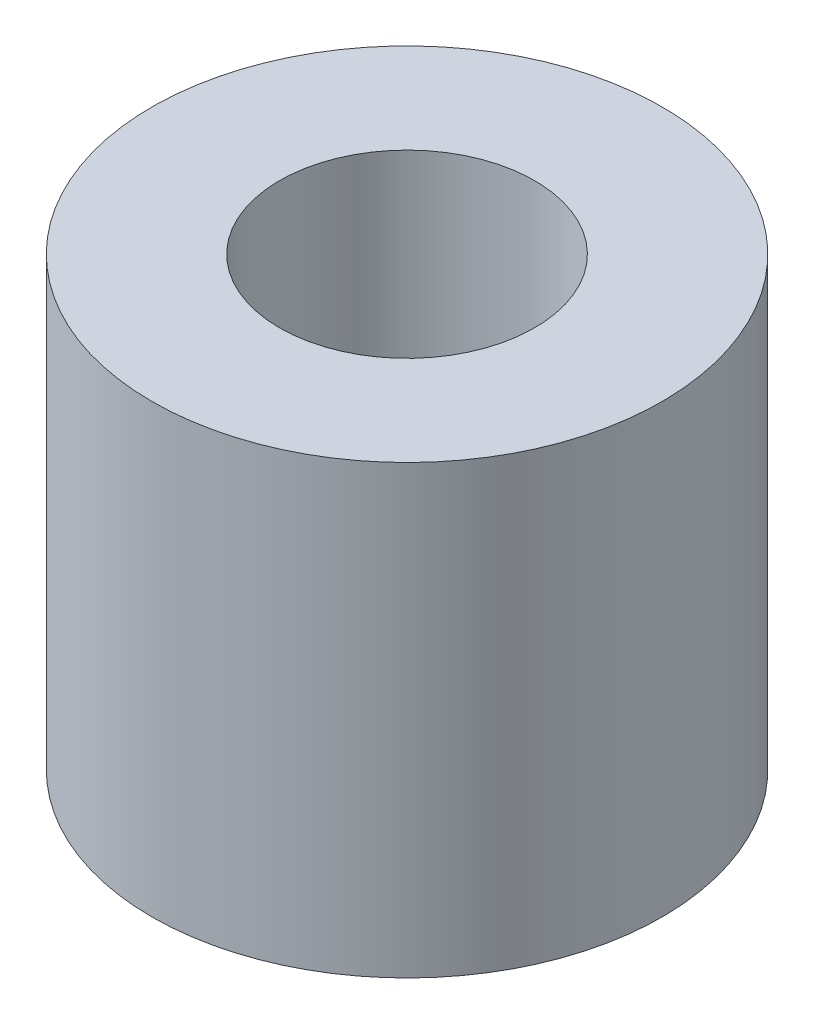
ISO-10303-21;
HEADER;
FILE_DESCRIPTION(('STEP AP214'),'2;1');
FILE_NAME('part.step','',(''),(''),'','','');
FILE_SCHEMA(('AUTOMOTIVE_DESIGN { 1 0 10303 214 1 1 1 1 }'));
ENDSEC;
DATA;
#1=APPLICATION_CONTEXT('core data for automotive mechanical design processes');
#2=APPLICATION_PROTOCOL_DEFINITION('international standard','automotive_design',2000,#1);
#3=PRODUCT_CONTEXT('',#1,'mechanical');
#4=PRODUCT('Part','Part','',(#3));
#5=PRODUCT_RELATED_PRODUCT_CATEGORY('part','',(#4));
#6=PRODUCT_DEFINITION_FORMATION('','',#4);
#7=PRODUCT_DEFINITION_CONTEXT('part definition',#1,'design');
#8=PRODUCT_DEFINITION('design','',#6,#7);
#9=PRODUCT_DEFINITION_SHAPE('','',#8);
#10=(LENGTH_UNIT() NAMED_UNIT(*) SI_UNIT(.MILLI.,.METRE.));
#11=(NAMED_UNIT(*) PLANE_ANGLE_UNIT() SI_UNIT($,.RADIAN.));
#12=(NAMED_UNIT(*) SI_UNIT($,.STERADIAN.) SOLID_ANGLE_UNIT());
#13=UNCERTAINTY_MEASURE_WITH_UNIT(LENGTH_MEASURE(1.E-05),#10,'distance_accuracy_value','');
#14=(GEOMETRIC_REPRESENTATION_CONTEXT(3) GLOBAL_UNCERTAINTY_ASSIGNED_CONTEXT((#13)) GLOBAL_UNIT_ASSIGNED_CONTEXT((#10,
#11,#12)) REPRESENTATION_CONTEXT('',''));
#15=CARTESIAN_POINT('',(0.,0.,0.));
#16=DIRECTION('',(0.,0.,1.));
#17=DIRECTION('',(1.,0.,0.));
#18=AXIS2_PLACEMENT_3D('',#15,#16,#17);
#19=CARTESIAN_POINT('',(0.,7.,0.));
#20=DIRECTION('',(0.,1.,0.));
#21=DIRECTION('',(0.,0.,1.));
#22=AXIS2_PLACEMENT_3D('',#19,#20,#21);
#23=PLANE('',#22);
#24=CARTESIAN_POINT('',(0.,7.,0.));
#25=DIRECTION('',(0.,1.,0.));
#26=DIRECTION('',(0.,0.,1.));
#27=AXIS2_PLACEMENT_3D('',#24,#25,#26);
#28=CIRCLE('',#27,4.);
#29=CARTESIAN_POINT('',(0.,7.,4.));
#30=VERTEX_POINT('',#29);
#31=EDGE_CURVE('E10',#30,#30,#28,.T.);
#32=ORIENTED_EDGE('',*,*,#31,.T.);
#33=EDGE_LOOP('',(#32));
#34=FACE_BOUND('',#33,.T.);
#35=CARTESIAN_POINT('',(0.,7.,0.));
#36=DIRECTION('',(0.,1.,0.));
#37=DIRECTION('',(0.,0.,1.));
#38=AXIS2_PLACEMENT_3D('',#35,#36,#37);
#39=CIRCLE('',#38,2.);
#40=CARTESIAN_POINT('',(0.,7.,2.));
#41=VERTEX_POINT('',#40);
#42=EDGE_CURVE('E42',#41,#41,#39,.T.);
#43=ORIENTED_EDGE('',*,*,#42,.F.);
#44=EDGE_LOOP('',(#43));
#45=FACE_BOUND('',#44,.T.);
#46=ADVANCED_FACE('F31',(#34,#45),#23,.T.);
#47=CARTESIAN_POINT('',(0.,0.,0.));
#48=DIRECTION('',(0.,1.,0.));
#49=DIRECTION('',(0.,0.,1.));
#50=AXIS2_PLACEMENT_3D('',#47,#48,#49);
#51=PLANE('',#50);
#52=CARTESIAN_POINT('',(0.,0.,0.));
#53=DIRECTION('',(0.,1.,0.));
#54=DIRECTION('',(0.,0.,1.));
#55=AXIS2_PLACEMENT_3D('',#52,#53,#54);
#56=CIRCLE('',#55,4.);
#57=CARTESIAN_POINT('',(0.,0.,4.));
#58=VERTEX_POINT('',#57);
#59=EDGE_CURVE('E35',#58,#58,#56,.T.);
#60=ORIENTED_EDGE('',*,*,#59,.F.);
#61=EDGE_LOOP('',(#60));
#62=FACE_BOUND('',#61,.T.);
#63=CARTESIAN_POINT('',(0.,0.,0.));
#64=DIRECTION('',(0.,1.,0.));
#65=DIRECTION('',(0.,0.,1.));
#66=AXIS2_PLACEMENT_3D('',#63,#64,#65);
#67=CIRCLE('',#66,2.);
#68=CARTESIAN_POINT('',(0.,0.,2.));
#69=VERTEX_POINT('',#68);
#70=EDGE_CURVE('E44',#69,#69,#67,.T.);
#71=ORIENTED_EDGE('',*,*,#70,.T.);
#72=EDGE_LOOP('',(#71));
#73=FACE_BOUND('',#72,.T.);
#74=ADVANCED_FACE('F54',(#62,#73),#51,.F.);
#75=CARTESIAN_POINT('',(0.,7.,0.));
#76=DIRECTION('',(0.,-1.,0.));
#77=DIRECTION('',(0.,0.,-1.));
#78=AXIS2_PLACEMENT_3D('',#75,#76,#77);
#79=CYLINDRICAL_SURFACE('',#78,4.);
#80=ORIENTED_EDGE('',*,*,#31,.F.);
#81=EDGE_LOOP('',(#80));
#82=FACE_BOUND('',#81,.T.);
#83=ORIENTED_EDGE('',*,*,#59,.T.);
#84=EDGE_LOOP('',(#83));
#85=FACE_BOUND('',#84,.T.);
#86=ADVANCED_FACE('F33',(#82,#85),#79,.T.);
#87=CARTESIAN_POINT('',(0.,7.,0.));
#88=DIRECTION('',(0.,-1.,0.));
#89=DIRECTION('',(0.,0.,-1.));
#90=AXIS2_PLACEMENT_3D('',#87,#88,#89);
#91=CYLINDRICAL_SURFACE('',#90,2.);
#92=ORIENTED_EDGE('',*,*,#42,.T.);
#93=EDGE_LOOP('',(#92));
#94=FACE_BOUND('',#93,.T.);
#95=ORIENTED_EDGE('',*,*,#70,.F.);
#96=EDGE_LOOP('',(#95));
#97=FACE_BOUND('',#96,.T.);
#98=ADVANCED_FACE('F50',(#94,#97),#91,.F.);
#99=CLOSED_SHELL('',(#46,#74,#86,#98));
#100=MANIFOLD_SOLID_BREP('B2',#99);
#101=ADVANCED_BREP_SHAPE_REPRESENTATION('',(#18,#100),#14);
#102=SHAPE_DEFINITION_REPRESENTATION(#9,#101);
ENDSEC;
END-ISO-10303-21;
